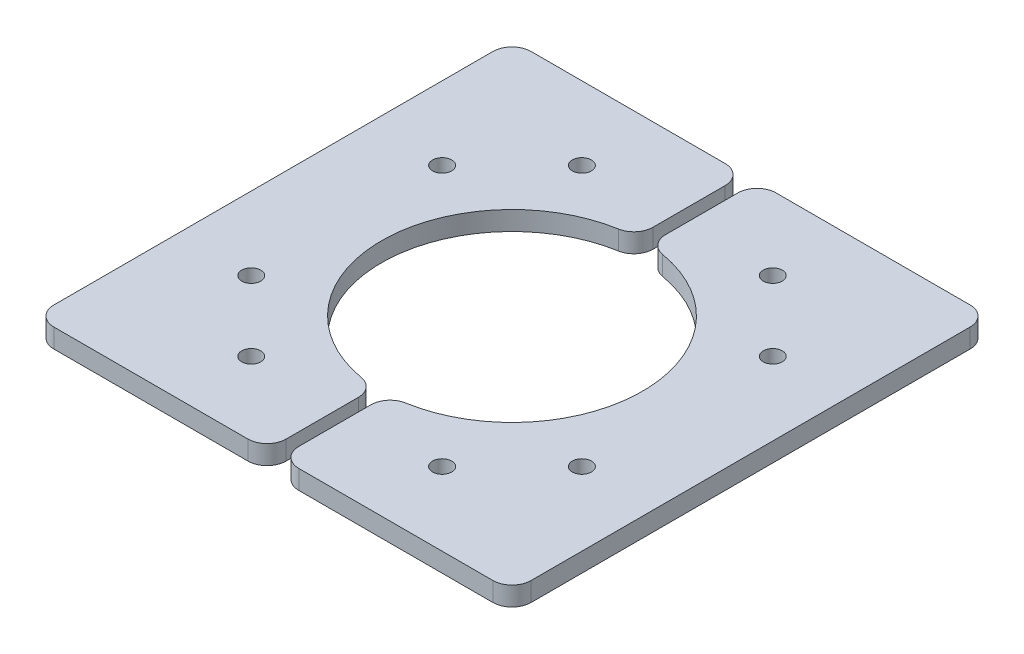
ISO-10303-21;
HEADER;
FILE_DESCRIPTION(('STEP AP214'),'2;1');
FILE_NAME('part.step','',(''),(''),'','','');
FILE_SCHEMA(('AUTOMOTIVE_DESIGN { 1 0 10303 214 1 1 1 1 }'));
ENDSEC;
DATA;
#1=APPLICATION_CONTEXT('core data for automotive mechanical design processes');
#2=APPLICATION_PROTOCOL_DEFINITION('international standard','automotive_design',2000,#1);
#3=PRODUCT_CONTEXT('',#1,'mechanical');
#4=PRODUCT('Part','Part','',(#3));
#5=PRODUCT_RELATED_PRODUCT_CATEGORY('part','',(#4));
#6=PRODUCT_DEFINITION_FORMATION('','',#4);
#7=PRODUCT_DEFINITION_CONTEXT('part definition',#1,'design');
#8=PRODUCT_DEFINITION('design','',#6,#7);
#9=PRODUCT_DEFINITION_SHAPE('','',#8);
#10=(LENGTH_UNIT() NAMED_UNIT(*) SI_UNIT(.MILLI.,.METRE.));
#11=(NAMED_UNIT(*) PLANE_ANGLE_UNIT() SI_UNIT($,.RADIAN.));
#12=(NAMED_UNIT(*) SI_UNIT($,.STERADIAN.) SOLID_ANGLE_UNIT());
#13=UNCERTAINTY_MEASURE_WITH_UNIT(LENGTH_MEASURE(1.E-05),#10,'distance_accuracy_value','');
#14=(GEOMETRIC_REPRESENTATION_CONTEXT(3) GLOBAL_UNCERTAINTY_ASSIGNED_CONTEXT((#13)) GLOBAL_UNIT_ASSIGNED_CONTEXT((#10,
#11,#12)) REPRESENTATION_CONTEXT('',''));
#15=CARTESIAN_POINT('',(0.,0.,0.));
#16=DIRECTION('',(0.,0.,1.));
#17=DIRECTION('',(1.,0.,0.));
#18=AXIS2_PLACEMENT_3D('',#15,#16,#17);
#19=CARTESIAN_POINT('',(0.,3.,-37.5));
#20=DIRECTION('',(0.,0.,-1.));
#21=DIRECTION('',(-1.,0.,0.));
#22=AXIS2_PLACEMENT_3D('',#19,#20,#21);
#23=PLANE('',#22);
#24=DIRECTION('',(1.,0.,0.));
#25=VECTOR('',#24,1.);
#26=CARTESIAN_POINT('',(0.,0.,-37.5));
#27=LINE('',#26,#25);
#28=CARTESIAN_POINT('',(-34.5,0.,-37.5));
#29=VERTEX_POINT('',#28);
#30=CARTESIAN_POINT('',(-4.00000000000001,0.,-37.5));
#31=VERTEX_POINT('',#30);
#32=EDGE_CURVE('E232',#29,#31,#27,.T.);
#33=ORIENTED_EDGE('',*,*,#32,.F.);
#34=DIRECTION('',(0.,-1.,0.));
#35=VECTOR('',#34,1.);
#36=CARTESIAN_POINT('',(-34.5,3.,-37.5));
#37=LINE('',#36,#35);
#38=CARTESIAN_POINT('',(-34.5,3.,-37.5));
#39=VERTEX_POINT('',#38);
#40=EDGE_CURVE('E68',#29,#39,#37,.F.);
#41=ORIENTED_EDGE('',*,*,#40,.T.);
#42=DIRECTION('',(1.,0.,0.));
#43=VECTOR('',#42,1.);
#44=CARTESIAN_POINT('',(0.,3.,-37.5));
#45=LINE('',#44,#43);
#46=CARTESIAN_POINT('',(-4.00000000000001,3.,-37.5));
#47=VERTEX_POINT('',#46);
#48=EDGE_CURVE('E235',#39,#47,#45,.T.);
#49=ORIENTED_EDGE('',*,*,#48,.T.);
#50=DIRECTION('',(0.,-1.,0.));
#51=VECTOR('',#50,1.);
#52=CARTESIAN_POINT('',(-4.00000000000001,3.,-37.5));
#53=LINE('',#52,#51);
#54=EDGE_CURVE('E146',#47,#31,#53,.T.);
#55=ORIENTED_EDGE('',*,*,#54,.T.);
#56=EDGE_LOOP('',(#33,#41,#49,#55));
#57=FACE_BOUND('',#56,.T.);
#58=ADVANCED_FACE('F46',(#57),#23,.T.);
#59=CARTESIAN_POINT('',(0.,3.,0.));
#60=DIRECTION('',(0.,-1.,0.));
#61=DIRECTION('',(0.,0.,-1.));
#62=AXIS2_PLACEMENT_3D('',#59,#60,#61);
#63=CYLINDRICAL_SURFACE('',#62,20.5);
#64=CARTESIAN_POINT('',(0.,0.,0.));
#65=DIRECTION('',(0.,1.,0.));
#66=DIRECTION('',(0.,0.,1.));
#67=AXIS2_PLACEMENT_3D('',#64,#65,#66);
#68=CIRCLE('',#67,20.5);
#69=CARTESIAN_POINT('',(-3.48936170212767,0.,-20.2008503512037));
#70=VERTEX_POINT('',#69);
#71=CARTESIAN_POINT('',(-3.48936170212767,0.,20.2008503512037));
#72=VERTEX_POINT('',#71);
#73=EDGE_CURVE('E229',#70,#72,#68,.T.);
#74=ORIENTED_EDGE('',*,*,#73,.F.);
#75=DIRECTION('',(0.,-1.,0.));
#76=VECTOR('',#75,1.);
#77=CARTESIAN_POINT('',(-3.48936170212767,3.,-20.2008503512037));
#78=LINE('',#77,#76);
#79=CARTESIAN_POINT('',(-3.48936170212767,3.,-20.2008503512037));
#80=VERTEX_POINT('',#79);
#81=EDGE_CURVE('E196',#70,#80,#78,.F.);
#82=ORIENTED_EDGE('',*,*,#81,.T.);
#83=CARTESIAN_POINT('',(0.,3.,0.));
#84=DIRECTION('',(0.,1.,0.));
#85=DIRECTION('',(0.,0.,1.));
#86=AXIS2_PLACEMENT_3D('',#83,#84,#85);
#87=CIRCLE('',#86,20.5);
#88=CARTESIAN_POINT('',(-3.48936170212767,3.,20.2008503512037));
#89=VERTEX_POINT('',#88);
#90=EDGE_CURVE('E237',#80,#89,#87,.T.);
#91=ORIENTED_EDGE('',*,*,#90,.T.);
#92=DIRECTION('',(0.,-1.,0.));
#93=VECTOR('',#92,1.);
#94=CARTESIAN_POINT('',(-3.48936170212767,3.,20.2008503512037));
#95=LINE('',#94,#93);
#96=EDGE_CURVE('E193',#89,#72,#95,.T.);
#97=ORIENTED_EDGE('',*,*,#96,.T.);
#98=EDGE_LOOP('',(#74,#82,#91,#97));
#99=FACE_BOUND('',#98,.T.);
#100=ADVANCED_FACE('F257',(#99),#63,.F.);
#101=CARTESIAN_POINT('',(0.,3.,37.5));
#102=DIRECTION('',(0.,0.,-1.));
#103=DIRECTION('',(-1.,0.,0.));
#104=AXIS2_PLACEMENT_3D('',#101,#102,#103);
#105=PLANE('',#104);
#106=DIRECTION('',(1.,0.,0.));
#107=VECTOR('',#106,1.);
#108=CARTESIAN_POINT('',(0.,3.,37.5));
#109=LINE('',#108,#107);
#110=CARTESIAN_POINT('',(-34.5,3.,37.5));
#111=VERTEX_POINT('',#110);
#112=CARTESIAN_POINT('',(-4.00000000000001,3.,37.5));
#113=VERTEX_POINT('',#112);
#114=EDGE_CURVE('E139',#111,#113,#109,.T.);
#115=ORIENTED_EDGE('',*,*,#114,.F.);
#116=DIRECTION('',(0.,-1.,0.));
#117=VECTOR('',#116,1.);
#118=CARTESIAN_POINT('',(-34.5,3.,37.5));
#119=LINE('',#118,#117);
#120=CARTESIAN_POINT('',(-34.5,0.,37.5));
#121=VERTEX_POINT('',#120);
#122=EDGE_CURVE('E153',#111,#121,#119,.T.);
#123=ORIENTED_EDGE('',*,*,#122,.T.);
#124=DIRECTION('',(1.,0.,0.));
#125=VECTOR('',#124,1.);
#126=CARTESIAN_POINT('',(0.,0.,37.5));
#127=LINE('',#126,#125);
#128=CARTESIAN_POINT('',(-4.00000000000001,0.,37.5));
#129=VERTEX_POINT('',#128);
#130=EDGE_CURVE('E157',#121,#129,#127,.T.);
#131=ORIENTED_EDGE('',*,*,#130,.T.);
#132=DIRECTION('',(0.,-1.,0.));
#133=VECTOR('',#132,1.);
#134=CARTESIAN_POINT('',(-4.00000000000001,3.,37.5));
#135=LINE('',#134,#133);
#136=EDGE_CURVE('E156',#129,#113,#135,.F.);
#137=ORIENTED_EDGE('',*,*,#136,.T.);
#138=EDGE_LOOP('',(#115,#123,#131,#137));
#139=FACE_BOUND('',#138,.T.);
#140=ADVANCED_FACE('F151',(#139),#105,.F.);
#141=CARTESIAN_POINT('',(0.,3.,0.));
#142=DIRECTION('',(0.,1.,0.));
#143=DIRECTION('',(0.,0.,1.));
#144=AXIS2_PLACEMENT_3D('',#141,#142,#143);
#145=PLANE('',#144);
#146=CARTESIAN_POINT('',(-25.9807621135332,3.,14.9999999999999));
#147=DIRECTION('',(0.,-1.,0.));
#148=DIRECTION('',(0.,0.,1.));
#149=AXIS2_PLACEMENT_3D('',#146,#147,#148);
#150=CIRCLE('',#149,1.50000000000001);
#151=CARTESIAN_POINT('',(-25.9807621135332,3.,16.4999999999999));
#152=VERTEX_POINT('',#151);
#153=EDGE_CURVE('E422',#152,#152,#150,.T.);
#154=ORIENTED_EDGE('',*,*,#153,.T.);
#155=EDGE_LOOP('',(#154));
#156=FACE_BOUND('',#155,.T.);
#157=CARTESIAN_POINT('',(-25.9807621135332,3.,-14.9999999999999));
#158=DIRECTION('',(0.,1.,0.));
#159=DIRECTION('',(0.,0.,-1.));
#160=AXIS2_PLACEMENT_3D('',#157,#158,#159);
#161=CIRCLE('',#160,1.50000000000001);
#162=CARTESIAN_POINT('',(-25.9807621135332,3.,-16.4999999999999));
#163=VERTEX_POINT('',#162);
#164=EDGE_CURVE('E426',#163,#163,#161,.T.);
#165=ORIENTED_EDGE('',*,*,#164,.F.);
#166=EDGE_LOOP('',(#165));
#167=FACE_BOUND('',#166,.T.);
#168=CARTESIAN_POINT('',(-15.,3.,-25.9807621135331));
#169=DIRECTION('',(0.,1.,0.));
#170=DIRECTION('',(0.,0.,-1.));
#171=AXIS2_PLACEMENT_3D('',#168,#169,#170);
#172=CIRCLE('',#171,1.49999999999999);
#173=CARTESIAN_POINT('',(-15.,3.,-27.4807621135331));
#174=VERTEX_POINT('',#173);
#175=EDGE_CURVE('E435',#174,#174,#172,.T.);
#176=ORIENTED_EDGE('',*,*,#175,.F.);
#177=EDGE_LOOP('',(#176));
#178=FACE_BOUND('',#177,.T.);
#179=CARTESIAN_POINT('',(-15.,3.,25.9807621135331));
#180=DIRECTION('',(0.,-1.,0.));
#181=DIRECTION('',(0.,0.,1.));
#182=AXIS2_PLACEMENT_3D('',#179,#180,#181);
#183=CIRCLE('',#182,1.5);
#184=CARTESIAN_POINT('',(-15.,3.,27.4807621135331));
#185=VERTEX_POINT('',#184);
#186=EDGE_CURVE('E441',#185,#185,#183,.T.);
#187=ORIENTED_EDGE('',*,*,#186,.T.);
#188=EDGE_LOOP('',(#187));
#189=FACE_BOUND('',#188,.T.);
#190=DIRECTION('',(0.,0.,1.));
#191=VECTOR('',#190,1.);
#192=CARTESIAN_POINT('',(-37.5,3.,0.));
#193=LINE('',#192,#191);
#194=CARTESIAN_POINT('',(-37.5,3.,-34.5));
#195=VERTEX_POINT('',#194);
#196=CARTESIAN_POINT('',(-37.5,3.,34.5));
#197=VERTEX_POINT('',#196);
#198=EDGE_CURVE('E142',#195,#197,#193,.T.);
#199=ORIENTED_EDGE('',*,*,#198,.T.);
#200=CARTESIAN_POINT('',(-34.5,3.,34.5));
#201=DIRECTION('',(0.,1.,0.));
#202=DIRECTION('',(0.,0.,1.));
#203=AXIS2_PLACEMENT_3D('',#200,#201,#202);
#204=CIRCLE('',#203,3.);
#205=EDGE_CURVE('E136',#197,#111,#204,.T.);
#206=ORIENTED_EDGE('',*,*,#205,.T.);
#207=ORIENTED_EDGE('',*,*,#114,.T.);
#208=CARTESIAN_POINT('',(-4.00000000000001,3.,34.5));
#209=DIRECTION('',(0.,1.,0.));
#210=DIRECTION('',(0.,0.,1.));
#211=AXIS2_PLACEMENT_3D('',#208,#209,#210);
#212=CIRCLE('',#211,3.);
#213=CARTESIAN_POINT('',(-1.00000000000001,3.,34.5));
#214=VERTEX_POINT('',#213);
#215=EDGE_CURVE('E183',#113,#214,#212,.T.);
#216=ORIENTED_EDGE('',*,*,#215,.T.);
#217=DIRECTION('',(0.,0.,1.));
#218=VECTOR('',#217,1.);
#219=CARTESIAN_POINT('',(-1.00000000000001,3.,-37.5));
#220=LINE('',#219,#218);
#221=CARTESIAN_POINT('',(-1.00000000000001,3.,23.1570723538188));
#222=VERTEX_POINT('',#221);
#223=EDGE_CURVE('E211',#222,#214,#220,.T.);
#224=ORIENTED_EDGE('',*,*,#223,.F.);
#225=CARTESIAN_POINT('',(-4.00000000000001,3.,23.1570723538188));
#226=DIRECTION('',(0.,1.,0.));
#227=DIRECTION('',(0.,0.,1.));
#228=AXIS2_PLACEMENT_3D('',#225,#226,#227);
#229=CIRCLE('',#228,3.);
#230=EDGE_CURVE('E185',#222,#89,#229,.T.);
#231=ORIENTED_EDGE('',*,*,#230,.T.);
#232=ORIENTED_EDGE('',*,*,#90,.F.);
#233=CARTESIAN_POINT('',(-4.00000000000001,3.,-23.1570723538188));
#234=DIRECTION('',(0.,1.,0.));
#235=DIRECTION('',(0.,0.,1.));
#236=AXIS2_PLACEMENT_3D('',#233,#234,#235);
#237=CIRCLE('',#236,3.);
#238=CARTESIAN_POINT('',(-1.00000000000001,3.,-23.1570723538188));
#239=VERTEX_POINT('',#238);
#240=EDGE_CURVE('E187',#80,#239,#237,.T.);
#241=ORIENTED_EDGE('',*,*,#240,.T.);
#242=CARTESIAN_POINT('',(-1.00000000000001,3.,-34.5));
#243=VERTEX_POINT('',#242);
#244=EDGE_CURVE('E218',#243,#239,#220,.T.);
#245=ORIENTED_EDGE('',*,*,#244,.F.);
#246=CARTESIAN_POINT('',(-4.00000000000001,3.,-34.5));
#247=DIRECTION('',(0.,1.,0.));
#248=DIRECTION('',(0.,0.,1.));
#249=AXIS2_PLACEMENT_3D('',#246,#247,#248);
#250=CIRCLE('',#249,3.);
#251=EDGE_CURVE('E61',#243,#47,#250,.T.);
#252=ORIENTED_EDGE('',*,*,#251,.T.);
#253=ORIENTED_EDGE('',*,*,#48,.F.);
#254=CARTESIAN_POINT('',(-34.5,3.,-34.5));
#255=DIRECTION('',(0.,1.,0.));
#256=DIRECTION('',(0.,0.,1.));
#257=AXIS2_PLACEMENT_3D('',#254,#255,#256);
#258=CIRCLE('',#257,3.);
#259=EDGE_CURVE('E147',#39,#195,#258,.T.);
#260=ORIENTED_EDGE('',*,*,#259,.T.);
#261=EDGE_LOOP('',(#199,#206,#207,#216,#224,#231,#232,#241,#245,#252,#253,#260));
#262=FACE_BOUND('',#261,.T.);
#263=ADVANCED_FACE('F138',(#156,#167,#178,#189,#262),#145,.T.);
#264=CARTESIAN_POINT('',(0.,0.,0.));
#265=DIRECTION('',(0.,1.,0.));
#266=DIRECTION('',(0.,0.,1.));
#267=AXIS2_PLACEMENT_3D('',#264,#265,#266);
#268=PLANE('',#267);
#269=CARTESIAN_POINT('',(-25.9807621135332,0.,14.9999999999999));
#270=DIRECTION('',(0.,-1.,0.));
#271=DIRECTION('',(0.,0.,1.));
#272=AXIS2_PLACEMENT_3D('',#269,#270,#271);
#273=CIRCLE('',#272,1.50000000000001);
#274=CARTESIAN_POINT('',(-25.9807621135332,0.,16.4999999999999));
#275=VERTEX_POINT('',#274);
#276=EDGE_CURVE('E425',#275,#275,#273,.T.);
#277=ORIENTED_EDGE('',*,*,#276,.F.);
#278=EDGE_LOOP('',(#277));
#279=FACE_BOUND('',#278,.T.);
#280=CARTESIAN_POINT('',(-25.9807621135332,0.,-14.9999999999999));
#281=DIRECTION('',(0.,1.,0.));
#282=DIRECTION('',(0.,0.,-1.));
#283=AXIS2_PLACEMENT_3D('',#280,#281,#282);
#284=CIRCLE('',#283,1.50000000000001);
#285=CARTESIAN_POINT('',(-25.9807621135332,0.,-16.4999999999999));
#286=VERTEX_POINT('',#285);
#287=EDGE_CURVE('E429',#286,#286,#284,.T.);
#288=ORIENTED_EDGE('',*,*,#287,.T.);
#289=EDGE_LOOP('',(#288));
#290=FACE_BOUND('',#289,.T.);
#291=CARTESIAN_POINT('',(-15.,0.,-25.9807621135331));
#292=DIRECTION('',(0.,1.,0.));
#293=DIRECTION('',(0.,0.,-1.));
#294=AXIS2_PLACEMENT_3D('',#291,#292,#293);
#295=CIRCLE('',#294,1.49999999999999);
#296=CARTESIAN_POINT('',(-15.,0.,-27.4807621135331));
#297=VERTEX_POINT('',#296);
#298=EDGE_CURVE('E438',#297,#297,#295,.T.);
#299=ORIENTED_EDGE('',*,*,#298,.T.);
#300=EDGE_LOOP('',(#299));
#301=FACE_BOUND('',#300,.T.);
#302=CARTESIAN_POINT('',(-15.,0.,25.9807621135331));
#303=DIRECTION('',(0.,-1.,0.));
#304=DIRECTION('',(0.,0.,1.));
#305=AXIS2_PLACEMENT_3D('',#302,#303,#304);
#306=CIRCLE('',#305,1.5);
#307=CARTESIAN_POINT('',(-15.,0.,27.4807621135331));
#308=VERTEX_POINT('',#307);
#309=EDGE_CURVE('E238',#308,#308,#306,.T.);
#310=ORIENTED_EDGE('',*,*,#309,.F.);
#311=EDGE_LOOP('',(#310));
#312=FACE_BOUND('',#311,.T.);
#313=ORIENTED_EDGE('',*,*,#130,.F.);
#314=CARTESIAN_POINT('',(-34.5,0.,34.5));
#315=DIRECTION('',(0.,1.,0.));
#316=DIRECTION('',(0.,0.,1.));
#317=AXIS2_PLACEMENT_3D('',#314,#315,#316);
#318=CIRCLE('',#317,3.);
#319=CARTESIAN_POINT('',(-37.5,0.,34.5));
#320=VERTEX_POINT('',#319);
#321=EDGE_CURVE('E160',#121,#320,#318,.F.);
#322=ORIENTED_EDGE('',*,*,#321,.T.);
#323=DIRECTION('',(0.,0.,1.));
#324=VECTOR('',#323,1.);
#325=CARTESIAN_POINT('',(-37.5,0.,0.));
#326=LINE('',#325,#324);
#327=CARTESIAN_POINT('',(-37.5,0.,-34.5));
#328=VERTEX_POINT('',#327);
#329=EDGE_CURVE('E223',#328,#320,#326,.T.);
#330=ORIENTED_EDGE('',*,*,#329,.F.);
#331=CARTESIAN_POINT('',(-34.5,0.,-34.5));
#332=DIRECTION('',(0.,1.,0.));
#333=DIRECTION('',(0.,0.,1.));
#334=AXIS2_PLACEMENT_3D('',#331,#332,#333);
#335=CIRCLE('',#334,3.);
#336=EDGE_CURVE('E174',#328,#29,#335,.F.);
#337=ORIENTED_EDGE('',*,*,#336,.T.);
#338=ORIENTED_EDGE('',*,*,#32,.T.);
#339=CARTESIAN_POINT('',(-4.00000000000001,0.,-34.5));
#340=DIRECTION('',(0.,1.,0.));
#341=DIRECTION('',(0.,0.,1.));
#342=AXIS2_PLACEMENT_3D('',#339,#340,#341);
#343=CIRCLE('',#342,3.);
#344=CARTESIAN_POINT('',(-1.00000000000001,0.,-34.5));
#345=VERTEX_POINT('',#344);
#346=EDGE_CURVE('E161',#31,#345,#343,.F.);
#347=ORIENTED_EDGE('',*,*,#346,.T.);
#348=DIRECTION('',(0.,0.,-1.));
#349=VECTOR('',#348,1.);
#350=CARTESIAN_POINT('',(-1.00000000000001,0.,0.));
#351=LINE('',#350,#349);
#352=CARTESIAN_POINT('',(-1.00000000000001,0.,-23.1570723538188));
#353=VERTEX_POINT('',#352);
#354=EDGE_CURVE('E217',#353,#345,#351,.T.);
#355=ORIENTED_EDGE('',*,*,#354,.F.);
#356=CARTESIAN_POINT('',(-4.00000000000001,0.,-23.1570723538188));
#357=DIRECTION('',(0.,1.,0.));
#358=DIRECTION('',(0.,0.,1.));
#359=AXIS2_PLACEMENT_3D('',#356,#357,#358);
#360=CIRCLE('',#359,3.);
#361=EDGE_CURVE('E172',#353,#70,#360,.F.);
#362=ORIENTED_EDGE('',*,*,#361,.T.);
#363=ORIENTED_EDGE('',*,*,#73,.T.);
#364=CARTESIAN_POINT('',(-4.00000000000001,0.,23.1570723538188));
#365=DIRECTION('',(0.,1.,0.));
#366=DIRECTION('',(0.,0.,1.));
#367=AXIS2_PLACEMENT_3D('',#364,#365,#366);
#368=CIRCLE('',#367,3.);
#369=CARTESIAN_POINT('',(-1.00000000000001,0.,23.1570723538188));
#370=VERTEX_POINT('',#369);
#371=EDGE_CURVE('E170',#72,#370,#368,.F.);
#372=ORIENTED_EDGE('',*,*,#371,.T.);
#373=CARTESIAN_POINT('',(-1.00000000000001,0.,34.5));
#374=VERTEX_POINT('',#373);
#375=EDGE_CURVE('E165',#374,#370,#351,.T.);
#376=ORIENTED_EDGE('',*,*,#375,.F.);
#377=CARTESIAN_POINT('',(-4.00000000000001,0.,34.5));
#378=DIRECTION('',(0.,1.,0.));
#379=DIRECTION('',(0.,0.,1.));
#380=AXIS2_PLACEMENT_3D('',#377,#378,#379);
#381=CIRCLE('',#380,3.);
#382=EDGE_CURVE('E163',#374,#129,#381,.F.);
#383=ORIENTED_EDGE('',*,*,#382,.T.);
#384=EDGE_LOOP('',(#313,#322,#330,#337,#338,#347,#355,#362,#363,#372,#376,#383));
#385=FACE_BOUND('',#384,.T.);
#386=ADVANCED_FACE('F214',(#279,#290,#301,#312,#385),#268,.F.);
#387=CARTESIAN_POINT('',(-37.5,3.,0.));
#388=DIRECTION('',(1.,0.,0.));
#389=DIRECTION('',(0.,0.,-1.));
#390=AXIS2_PLACEMENT_3D('',#387,#388,#389);
#391=PLANE('',#390);
#392=ORIENTED_EDGE('',*,*,#329,.T.);
#393=DIRECTION('',(0.,-1.,0.));
#394=VECTOR('',#393,1.);
#395=CARTESIAN_POINT('',(-37.5,3.,34.5));
#396=LINE('',#395,#394);
#397=EDGE_CURVE('E180',#320,#197,#396,.F.);
#398=ORIENTED_EDGE('',*,*,#397,.T.);
#399=ORIENTED_EDGE('',*,*,#198,.F.);
#400=DIRECTION('',(0.,-1.,0.));
#401=VECTOR('',#400,1.);
#402=CARTESIAN_POINT('',(-37.5,0.,-34.5));
#403=LINE('',#402,#401);
#404=EDGE_CURVE('E177',#195,#328,#403,.T.);
#405=ORIENTED_EDGE('',*,*,#404,.T.);
#406=EDGE_LOOP('',(#392,#398,#399,#405));
#407=FACE_BOUND('',#406,.T.);
#408=ADVANCED_FACE('F248',(#407),#391,.F.);
#409=CARTESIAN_POINT('',(-1.00000000000001,3.,-37.5));
#410=DIRECTION('',(1.,0.,0.));
#411=DIRECTION('',(0.,0.,-1.));
#412=AXIS2_PLACEMENT_3D('',#409,#410,#411);
#413=PLANE('',#412);
#414=ORIENTED_EDGE('',*,*,#244,.T.);
#415=DIRECTION('',(0.,-1.,0.));
#416=VECTOR('',#415,1.);
#417=CARTESIAN_POINT('',(-1.00000000000001,3.,-23.1570723538188));
#418=LINE('',#417,#416);
#419=EDGE_CURVE('E201',#239,#353,#418,.T.);
#420=ORIENTED_EDGE('',*,*,#419,.T.);
#421=ORIENTED_EDGE('',*,*,#354,.T.);
#422=DIRECTION('',(0.,-1.,0.));
#423=VECTOR('',#422,1.);
#424=CARTESIAN_POINT('',(-1.00000000000001,3.,-34.5));
#425=LINE('',#424,#423);
#426=EDGE_CURVE('E199',#345,#243,#425,.F.);
#427=ORIENTED_EDGE('',*,*,#426,.T.);
#428=EDGE_LOOP('',(#414,#420,#421,#427));
#429=FACE_BOUND('',#428,.T.);
#430=ADVANCED_FACE('F263',(#429),#413,.T.);
#431=ORIENTED_EDGE('',*,*,#375,.T.);
#432=DIRECTION('',(0.,-1.,0.));
#433=VECTOR('',#432,1.);
#434=CARTESIAN_POINT('',(-1.00000000000001,3.,23.1570723538188));
#435=LINE('',#434,#433);
#436=EDGE_CURVE('E13',#370,#222,#435,.F.);
#437=ORIENTED_EDGE('',*,*,#436,.T.);
#438=ORIENTED_EDGE('',*,*,#223,.T.);
#439=DIRECTION('',(0.,-1.,0.));
#440=VECTOR('',#439,1.);
#441=CARTESIAN_POINT('',(-1.00000000000001,0.,34.5));
#442=LINE('',#441,#440);
#443=EDGE_CURVE('E54',#214,#374,#442,.T.);
#444=ORIENTED_EDGE('',*,*,#443,.T.);
#445=EDGE_LOOP('',(#431,#437,#438,#444));
#446=FACE_BOUND('',#445,.T.);
#447=ADVANCED_FACE('F208',(#446),#413,.T.);
#448=CARTESIAN_POINT('',(-34.5,3.,34.5));
#449=DIRECTION('',(0.,-1.,0.));
#450=DIRECTION('',(0.,0.,-1.));
#451=AXIS2_PLACEMENT_3D('',#448,#449,#450);
#452=CYLINDRICAL_SURFACE('',#451,3.);
#453=ORIENTED_EDGE('',*,*,#205,.F.);
#454=ORIENTED_EDGE('',*,*,#397,.F.);
#455=ORIENTED_EDGE('',*,*,#321,.F.);
#456=ORIENTED_EDGE('',*,*,#122,.F.);
#457=EDGE_LOOP('',(#453,#454,#455,#456));
#458=FACE_BOUND('',#457,.T.);
#459=ADVANCED_FACE('F159',(#458),#452,.T.);
#460=CARTESIAN_POINT('',(-34.5,3.,-34.5));
#461=DIRECTION('',(0.,1.,0.));
#462=DIRECTION('',(0.,0.,1.));
#463=AXIS2_PLACEMENT_3D('',#460,#461,#462);
#464=CYLINDRICAL_SURFACE('',#463,3.);
#465=ORIENTED_EDGE('',*,*,#259,.F.);
#466=ORIENTED_EDGE('',*,*,#40,.F.);
#467=ORIENTED_EDGE('',*,*,#336,.F.);
#468=ORIENTED_EDGE('',*,*,#404,.F.);
#469=EDGE_LOOP('',(#465,#466,#467,#468));
#470=FACE_BOUND('',#469,.T.);
#471=ADVANCED_FACE('F246',(#470),#464,.T.);
#472=CARTESIAN_POINT('',(-4.00000000000001,3.,-23.1570723538188));
#473=DIRECTION('',(0.,-1.,0.));
#474=DIRECTION('',(0.,0.,-1.));
#475=AXIS2_PLACEMENT_3D('',#472,#473,#474);
#476=CYLINDRICAL_SURFACE('',#475,3.);
#477=ORIENTED_EDGE('',*,*,#361,.F.);
#478=ORIENTED_EDGE('',*,*,#419,.F.);
#479=ORIENTED_EDGE('',*,*,#240,.F.);
#480=ORIENTED_EDGE('',*,*,#81,.F.);
#481=EDGE_LOOP('',(#477,#478,#479,#480));
#482=FACE_BOUND('',#481,.T.);
#483=ADVANCED_FACE('F262',(#482),#476,.T.);
#484=CARTESIAN_POINT('',(-4.00000000000001,3.,23.1570723538188));
#485=DIRECTION('',(0.,-1.,0.));
#486=DIRECTION('',(0.,0.,-1.));
#487=AXIS2_PLACEMENT_3D('',#484,#485,#486);
#488=CYLINDRICAL_SURFACE('',#487,3.);
#489=ORIENTED_EDGE('',*,*,#230,.F.);
#490=ORIENTED_EDGE('',*,*,#436,.F.);
#491=ORIENTED_EDGE('',*,*,#371,.F.);
#492=ORIENTED_EDGE('',*,*,#96,.F.);
#493=EDGE_LOOP('',(#489,#490,#491,#492));
#494=FACE_BOUND('',#493,.T.);
#495=ADVANCED_FACE('F254',(#494),#488,.T.);
#496=CARTESIAN_POINT('',(-4.00000000000001,3.,34.5));
#497=DIRECTION('',(0.,1.,0.));
#498=DIRECTION('',(0.,0.,1.));
#499=AXIS2_PLACEMENT_3D('',#496,#497,#498);
#500=CYLINDRICAL_SURFACE('',#499,3.);
#501=ORIENTED_EDGE('',*,*,#215,.F.);
#502=ORIENTED_EDGE('',*,*,#136,.F.);
#503=ORIENTED_EDGE('',*,*,#382,.F.);
#504=ORIENTED_EDGE('',*,*,#443,.F.);
#505=EDGE_LOOP('',(#501,#502,#503,#504));
#506=FACE_BOUND('',#505,.T.);
#507=ADVANCED_FACE('F249',(#506),#500,.T.);
#508=CARTESIAN_POINT('',(-4.00000000000001,3.,-34.5));
#509=DIRECTION('',(0.,-1.,0.));
#510=DIRECTION('',(0.,0.,-1.));
#511=AXIS2_PLACEMENT_3D('',#508,#509,#510);
#512=CYLINDRICAL_SURFACE('',#511,3.);
#513=ORIENTED_EDGE('',*,*,#251,.F.);
#514=ORIENTED_EDGE('',*,*,#426,.F.);
#515=ORIENTED_EDGE('',*,*,#346,.F.);
#516=ORIENTED_EDGE('',*,*,#54,.F.);
#517=EDGE_LOOP('',(#513,#514,#515,#516));
#518=FACE_BOUND('',#517,.T.);
#519=ADVANCED_FACE('F48',(#518),#512,.T.);
#520=CARTESIAN_POINT('',(-15.,3.,25.9807621135331));
#521=DIRECTION('',(0.,-1.,0.));
#522=DIRECTION('',(0.,0.,-1.));
#523=AXIS2_PLACEMENT_3D('',#520,#521,#522);
#524=CYLINDRICAL_SURFACE('',#523,1.5);
#525=ORIENTED_EDGE('',*,*,#186,.F.);
#526=EDGE_LOOP('',(#525));
#527=FACE_BOUND('',#526,.T.);
#528=ORIENTED_EDGE('',*,*,#309,.T.);
#529=EDGE_LOOP('',(#528));
#530=FACE_BOUND('',#529,.T.);
#531=ADVANCED_FACE('F266',(#527,#530),#524,.F.);
#532=CARTESIAN_POINT('',(-15.,3.,-25.9807621135331));
#533=DIRECTION('',(0.,-1.,0.));
#534=DIRECTION('',(0.,0.,-1.));
#535=AXIS2_PLACEMENT_3D('',#532,#533,#534);
#536=CYLINDRICAL_SURFACE('',#535,1.49999999999999);
#537=ORIENTED_EDGE('',*,*,#175,.T.);
#538=EDGE_LOOP('',(#537));
#539=FACE_BOUND('',#538,.T.);
#540=ORIENTED_EDGE('',*,*,#298,.F.);
#541=EDGE_LOOP('',(#540));
#542=FACE_BOUND('',#541,.T.);
#543=ADVANCED_FACE('F271',(#539,#542),#536,.F.);
#544=CARTESIAN_POINT('',(-25.9807621135332,3.,-14.9999999999999));
#545=DIRECTION('',(0.,-1.,0.));
#546=DIRECTION('',(0.,0.,-1.));
#547=AXIS2_PLACEMENT_3D('',#544,#545,#546);
#548=CYLINDRICAL_SURFACE('',#547,1.50000000000001);
#549=ORIENTED_EDGE('',*,*,#164,.T.);
#550=EDGE_LOOP('',(#549));
#551=FACE_BOUND('',#550,.T.);
#552=ORIENTED_EDGE('',*,*,#287,.F.);
#553=EDGE_LOOP('',(#552));
#554=FACE_BOUND('',#553,.T.);
#555=ADVANCED_FACE('F338',(#551,#554),#548,.F.);
#556=CARTESIAN_POINT('',(-25.9807621135332,3.,14.9999999999999));
#557=DIRECTION('',(0.,-1.,0.));
#558=DIRECTION('',(0.,0.,-1.));
#559=AXIS2_PLACEMENT_3D('',#556,#557,#558);
#560=CYLINDRICAL_SURFACE('',#559,1.50000000000001);
#561=ORIENTED_EDGE('',*,*,#153,.F.);
#562=EDGE_LOOP('',(#561));
#563=FACE_BOUND('',#562,.T.);
#564=ORIENTED_EDGE('',*,*,#276,.T.);
#565=EDGE_LOOP('',(#564));
#566=FACE_BOUND('',#565,.T.);
#567=ADVANCED_FACE('F348',(#563,#566),#560,.F.);
#568=CLOSED_SHELL('',(#58,#100,#140,#263,#386,#408,#430,#447,#459,#471,#483,#495,#507,#519,#531,
#543,#555,#567));
#569=MANIFOLD_SOLID_BREP('B2',#568);
#570=CARTESIAN_POINT('',(0.,3.,0.));
#571=DIRECTION('',(0.,1.,0.));
#572=DIRECTION('',(0.,0.,1.));
#573=AXIS2_PLACEMENT_3D('',#570,#571,#572);
#574=PLANE('',#573);
#575=CARTESIAN_POINT('',(25.9807621135332,3.,14.9999999999999));
#576=DIRECTION('',(0.,1.,0.));
#577=DIRECTION('',(0.,0.,1.));
#578=AXIS2_PLACEMENT_3D('',#575,#576,#577);
#579=CIRCLE('',#578,1.50000000000001);
#580=CARTESIAN_POINT('',(25.9807621135332,3.,16.4999999999999));
#581=VERTEX_POINT('',#580);
#582=EDGE_CURVE('E663',#581,#581,#579,.T.);
#583=ORIENTED_EDGE('',*,*,#582,.F.);
#584=EDGE_LOOP('',(#583));
#585=FACE_BOUND('',#584,.T.);
#586=CARTESIAN_POINT('',(25.9807621135332,3.,-14.9999999999999));
#587=DIRECTION('',(0.,-1.,0.));
#588=DIRECTION('',(0.,0.,-1.));
#589=AXIS2_PLACEMENT_3D('',#586,#587,#588);
#590=CIRCLE('',#589,1.50000000000001);
#591=CARTESIAN_POINT('',(25.9807621135332,3.,-16.4999999999999));
#592=VERTEX_POINT('',#591);
#593=EDGE_CURVE('E657',#592,#592,#590,.T.);
#594=ORIENTED_EDGE('',*,*,#593,.T.);
#595=EDGE_LOOP('',(#594));
#596=FACE_BOUND('',#595,.T.);
#597=CARTESIAN_POINT('',(15.,3.,-25.9807621135331));
#598=DIRECTION('',(0.,-1.,0.));
#599=DIRECTION('',(0.,0.,-1.));
#600=AXIS2_PLACEMENT_3D('',#597,#598,#599);
#601=CIRCLE('',#600,1.49999999999999);
#602=CARTESIAN_POINT('',(15.,3.,-27.4807621135331));
#603=VERTEX_POINT('',#602);
#604=EDGE_CURVE('E651',#603,#603,#601,.T.);
#605=ORIENTED_EDGE('',*,*,#604,.T.);
#606=EDGE_LOOP('',(#605));
#607=FACE_BOUND('',#606,.T.);
#608=DIRECTION('',(1.,0.,0.));
#609=VECTOR('',#608,1.);
#610=CARTESIAN_POINT('',(0.,3.,37.5));
#611=LINE('',#610,#609);
#612=CARTESIAN_POINT('',(3.99999999999999,3.,37.5));
#613=VERTEX_POINT('',#612);
#614=CARTESIAN_POINT('',(34.5,3.,37.5));
#615=VERTEX_POINT('',#614);
#616=EDGE_CURVE('E628',#613,#615,#611,.T.);
#617=ORIENTED_EDGE('',*,*,#616,.T.);
#618=CARTESIAN_POINT('',(34.5,3.,34.5));
#619=DIRECTION('',(0.,1.,0.));
#620=DIRECTION('',(0.,0.,1.));
#621=AXIS2_PLACEMENT_3D('',#618,#619,#620);
#622=CIRCLE('',#621,3.);
#623=CARTESIAN_POINT('',(37.5,3.,34.5));
#624=VERTEX_POINT('',#623);
#625=EDGE_CURVE('E606',#615,#624,#622,.T.);
#626=ORIENTED_EDGE('',*,*,#625,.T.);
#627=DIRECTION('',(0.,0.,1.));
#628=VECTOR('',#627,1.);
#629=CARTESIAN_POINT('',(37.5,3.,0.));
#630=LINE('',#629,#628);
#631=CARTESIAN_POINT('',(37.5,3.,-34.5));
#632=VERTEX_POINT('',#631);
#633=EDGE_CURVE('E629',#632,#624,#630,.T.);
#634=ORIENTED_EDGE('',*,*,#633,.F.);
#635=CARTESIAN_POINT('',(34.5,3.,-34.5));
#636=DIRECTION('',(0.,1.,0.));
#637=DIRECTION('',(0.,0.,1.));
#638=AXIS2_PLACEMENT_3D('',#635,#636,#637);
#639=CIRCLE('',#638,3.);
#640=CARTESIAN_POINT('',(34.5,3.,-37.5));
#641=VERTEX_POINT('',#640);
#642=EDGE_CURVE('E575',#632,#641,#639,.T.);
#643=ORIENTED_EDGE('',*,*,#642,.T.);
#644=DIRECTION('',(1.,0.,0.));
#645=VECTOR('',#644,1.);
#646=CARTESIAN_POINT('',(0.,3.,-37.5));
#647=LINE('',#646,#645);
#648=CARTESIAN_POINT('',(3.99999999999999,3.,-37.5));
#649=VERTEX_POINT('',#648);
#650=EDGE_CURVE('E626',#649,#641,#647,.T.);
#651=ORIENTED_EDGE('',*,*,#650,.F.);
#652=CARTESIAN_POINT('',(3.99999999999999,3.,-34.5));
#653=DIRECTION('',(0.,1.,0.));
#654=DIRECTION('',(0.,0.,1.));
#655=AXIS2_PLACEMENT_3D('',#652,#653,#654);
#656=CIRCLE('',#655,3.);
#657=CARTESIAN_POINT('',(0.999999999999993,3.,-34.5));
#658=VERTEX_POINT('',#657);
#659=EDGE_CURVE('E599',#649,#658,#656,.T.);
#660=ORIENTED_EDGE('',*,*,#659,.T.);
#661=DIRECTION('',(0.,0.,-1.));
#662=VECTOR('',#661,1.);
#663=CARTESIAN_POINT('',(0.999999999999993,3.,-37.5));
#664=LINE('',#663,#662);
#665=CARTESIAN_POINT('',(0.999999999999993,3.,-23.1570723538188));
#666=VERTEX_POINT('',#665);
#667=EDGE_CURVE('E650',#666,#658,#664,.T.);
#668=ORIENTED_EDGE('',*,*,#667,.F.);
#669=CARTESIAN_POINT('',(3.99999999999999,3.,-23.1570723538188));
#670=DIRECTION('',(0.,1.,0.));
#671=DIRECTION('',(0.,0.,1.));
#672=AXIS2_PLACEMENT_3D('',#669,#670,#671);
#673=CIRCLE('',#672,3.);
#674=CARTESIAN_POINT('',(3.48936170212765,3.,-20.2008503512037));
#675=VERTEX_POINT('',#674);
#676=EDGE_CURVE('E601',#666,#675,#673,.T.);
#677=ORIENTED_EDGE('',*,*,#676,.T.);
#678=CARTESIAN_POINT('',(0.,3.,0.));
#679=DIRECTION('',(0.,1.,0.));
#680=DIRECTION('',(0.,0.,1.));
#681=AXIS2_PLACEMENT_3D('',#678,#679,#680);
#682=CIRCLE('',#681,20.5);
#683=CARTESIAN_POINT('',(3.48936170212765,3.,20.2008503512037));
#684=VERTEX_POINT('',#683);
#685=EDGE_CURVE('E633',#684,#675,#682,.T.);
#686=ORIENTED_EDGE('',*,*,#685,.F.);
#687=CARTESIAN_POINT('',(3.99999999999999,3.,23.1570723538188));
#688=DIRECTION('',(0.,1.,0.));
#689=DIRECTION('',(0.,0.,1.));
#690=AXIS2_PLACEMENT_3D('',#687,#688,#689);
#691=CIRCLE('',#690,3.);
#692=CARTESIAN_POINT('',(0.999999999999993,3.,23.1570723538188));
#693=VERTEX_POINT('',#692);
#694=EDGE_CURVE('E477',#684,#693,#691,.T.);
#695=ORIENTED_EDGE('',*,*,#694,.T.);
#696=CARTESIAN_POINT('',(0.999999999999993,3.,34.5));
#697=VERTEX_POINT('',#696);
#698=EDGE_CURVE('E638',#697,#693,#664,.T.);
#699=ORIENTED_EDGE('',*,*,#698,.F.);
#700=CARTESIAN_POINT('',(3.99999999999999,3.,34.5));
#701=DIRECTION('',(0.,1.,0.));
#702=DIRECTION('',(0.,0.,1.));
#703=AXIS2_PLACEMENT_3D('',#700,#701,#702);
#704=CIRCLE('',#703,3.);
#705=EDGE_CURVE('E604',#697,#613,#704,.T.);
#706=ORIENTED_EDGE('',*,*,#705,.T.);
#707=EDGE_LOOP('',(#617,#626,#634,#643,#651,#660,#668,#677,#686,#695,#699,#706));
#708=FACE_BOUND('',#707,.T.);
#709=CARTESIAN_POINT('',(15.,3.,25.9807621135331));
#710=DIRECTION('',(0.,1.,0.));
#711=DIRECTION('',(0.,0.,1.));
#712=AXIS2_PLACEMENT_3D('',#709,#710,#711);
#713=CIRCLE('',#712,1.5);
#714=CARTESIAN_POINT('',(15.,3.,27.4807621135331));
#715=VERTEX_POINT('',#714);
#716=EDGE_CURVE('E672',#715,#715,#713,.T.);
#717=ORIENTED_EDGE('',*,*,#716,.F.);
#718=EDGE_LOOP('',(#717));
#719=FACE_BOUND('',#718,.T.);
#720=ADVANCED_FACE('F462',(#585,#596,#607,#708,#719),#574,.T.);
#721=CARTESIAN_POINT('',(0.,0.,0.));
#722=DIRECTION('',(0.,1.,0.));
#723=DIRECTION('',(0.,0.,1.));
#724=AXIS2_PLACEMENT_3D('',#721,#722,#723);
#725=PLANE('',#724);
#726=CARTESIAN_POINT('',(25.9807621135332,0.,-14.9999999999999));
#727=DIRECTION('',(0.,-1.,0.));
#728=DIRECTION('',(0.,0.,-1.));
#729=AXIS2_PLACEMENT_3D('',#726,#727,#728);
#730=CIRCLE('',#729,1.50000000000001);
#731=CARTESIAN_POINT('',(25.9807621135332,0.,-16.4999999999999));
#732=VERTEX_POINT('',#731);
#733=EDGE_CURVE('E660',#732,#732,#730,.T.);
#734=ORIENTED_EDGE('',*,*,#733,.F.);
#735=EDGE_LOOP('',(#734));
#736=FACE_BOUND('',#735,.T.);
#737=CARTESIAN_POINT('',(15.,0.,-25.9807621135331));
#738=DIRECTION('',(0.,-1.,0.));
#739=DIRECTION('',(0.,0.,-1.));
#740=AXIS2_PLACEMENT_3D('',#737,#738,#739);
#741=CIRCLE('',#740,1.49999999999999);
#742=CARTESIAN_POINT('',(15.,0.,-27.4807621135331));
#743=VERTEX_POINT('',#742);
#744=EDGE_CURVE('E654',#743,#743,#741,.T.);
#745=ORIENTED_EDGE('',*,*,#744,.F.);
#746=EDGE_LOOP('',(#745));
#747=FACE_BOUND('',#746,.T.);
#748=DIRECTION('',(0.,0.,1.));
#749=VECTOR('',#748,1.);
#750=CARTESIAN_POINT('',(37.5,0.,0.));
#751=LINE('',#750,#749);
#752=CARTESIAN_POINT('',(37.5,0.,-34.5));
#753=VERTEX_POINT('',#752);
#754=CARTESIAN_POINT('',(37.5,0.,34.5));
#755=VERTEX_POINT('',#754);
#756=EDGE_CURVE('E555',#753,#755,#751,.T.);
#757=ORIENTED_EDGE('',*,*,#756,.T.);
#758=CARTESIAN_POINT('',(34.5,0.,34.5));
#759=DIRECTION('',(0.,1.,0.));
#760=DIRECTION('',(0.,0.,1.));
#761=AXIS2_PLACEMENT_3D('',#758,#759,#760);
#762=CIRCLE('',#761,3.);
#763=CARTESIAN_POINT('',(34.5,0.,37.5));
#764=VERTEX_POINT('',#763);
#765=EDGE_CURVE('E591',#755,#764,#762,.F.);
#766=ORIENTED_EDGE('',*,*,#765,.T.);
#767=DIRECTION('',(1.,0.,0.));
#768=VECTOR('',#767,1.);
#769=CARTESIAN_POINT('',(0.,0.,37.5));
#770=LINE('',#769,#768);
#771=CARTESIAN_POINT('',(3.99999999999999,0.,37.5));
#772=VERTEX_POINT('',#771);
#773=EDGE_CURVE('E640',#772,#764,#770,.T.);
#774=ORIENTED_EDGE('',*,*,#773,.F.);
#775=CARTESIAN_POINT('',(3.99999999999999,0.,34.5));
#776=DIRECTION('',(0.,1.,0.));
#777=DIRECTION('',(0.,0.,1.));
#778=AXIS2_PLACEMENT_3D('',#775,#776,#777);
#779=CIRCLE('',#778,3.);
#780=CARTESIAN_POINT('',(0.999999999999993,0.,34.5));
#781=VERTEX_POINT('',#780);
#782=EDGE_CURVE('E589',#772,#781,#779,.F.);
#783=ORIENTED_EDGE('',*,*,#782,.T.);
#784=DIRECTION('',(0.,0.,1.));
#785=VECTOR('',#784,1.);
#786=CARTESIAN_POINT('',(0.999999999999993,0.,0.));
#787=LINE('',#786,#785);
#788=CARTESIAN_POINT('',(0.999999999999993,0.,23.1570723538188));
#789=VERTEX_POINT('',#788);
#790=EDGE_CURVE('E580',#789,#781,#787,.T.);
#791=ORIENTED_EDGE('',*,*,#790,.F.);
#792=CARTESIAN_POINT('',(3.99999999999999,0.,23.1570723538188));
#793=DIRECTION('',(0.,1.,0.));
#794=DIRECTION('',(0.,0.,1.));
#795=AXIS2_PLACEMENT_3D('',#792,#793,#794);
#796=CIRCLE('',#795,3.);
#797=CARTESIAN_POINT('',(3.48936170212765,0.,20.2008503512037));
#798=VERTEX_POINT('',#797);
#799=EDGE_CURVE('E587',#789,#798,#796,.F.);
#800=ORIENTED_EDGE('',*,*,#799,.T.);
#801=CARTESIAN_POINT('',(0.,0.,0.));
#802=DIRECTION('',(0.,1.,0.));
#803=DIRECTION('',(0.,0.,1.));
#804=AXIS2_PLACEMENT_3D('',#801,#802,#803);
#805=CIRCLE('',#804,20.5);
#806=CARTESIAN_POINT('',(3.48936170212765,0.,-20.2008503512037));
#807=VERTEX_POINT('',#806);
#808=EDGE_CURVE('E572',#798,#807,#805,.T.);
#809=ORIENTED_EDGE('',*,*,#808,.T.);
#810=CARTESIAN_POINT('',(3.99999999999999,0.,-23.1570723538188));
#811=DIRECTION('',(0.,1.,0.));
#812=DIRECTION('',(0.,0.,1.));
#813=AXIS2_PLACEMENT_3D('',#810,#811,#812);
#814=CIRCLE('',#813,3.);
#815=CARTESIAN_POINT('',(0.999999999999993,0.,-23.1570723538188));
#816=VERTEX_POINT('',#815);
#817=EDGE_CURVE('E585',#807,#816,#814,.F.);
#818=ORIENTED_EDGE('',*,*,#817,.T.);
#819=CARTESIAN_POINT('',(0.999999999999993,0.,-34.5));
#820=VERTEX_POINT('',#819);
#821=EDGE_CURVE('E576',#820,#816,#787,.T.);
#822=ORIENTED_EDGE('',*,*,#821,.F.);
#823=CARTESIAN_POINT('',(3.99999999999999,0.,-34.5));
#824=DIRECTION('',(0.,1.,0.));
#825=DIRECTION('',(0.,0.,1.));
#826=AXIS2_PLACEMENT_3D('',#823,#824,#825);
#827=CIRCLE('',#826,3.);
#828=CARTESIAN_POINT('',(3.99999999999999,0.,-37.5));
#829=VERTEX_POINT('',#828);
#830=EDGE_CURVE('E562',#820,#829,#827,.F.);
#831=ORIENTED_EDGE('',*,*,#830,.T.);
#832=DIRECTION('',(1.,0.,0.));
#833=VECTOR('',#832,1.);
#834=CARTESIAN_POINT('',(0.,0.,-37.5));
#835=LINE('',#834,#833);
#836=CARTESIAN_POINT('',(34.5,0.,-37.5));
#837=VERTEX_POINT('',#836);
#838=EDGE_CURVE('E557',#829,#837,#835,.T.);
#839=ORIENTED_EDGE('',*,*,#838,.T.);
#840=CARTESIAN_POINT('',(34.5,0.,-34.5));
#841=DIRECTION('',(0.,1.,0.));
#842=DIRECTION('',(0.,0.,1.));
#843=AXIS2_PLACEMENT_3D('',#840,#841,#842);
#844=CIRCLE('',#843,3.);
#845=EDGE_CURVE('E551',#837,#753,#844,.F.);
#846=ORIENTED_EDGE('',*,*,#845,.T.);
#847=EDGE_LOOP('',(#757,#766,#774,#783,#791,#800,#809,#818,#822,#831,#839,#846));
#848=FACE_BOUND('',#847,.T.);
#849=CARTESIAN_POINT('',(25.9807621135332,0.,14.9999999999999));
#850=DIRECTION('',(0.,1.,0.));
#851=DIRECTION('',(0.,0.,1.));
#852=AXIS2_PLACEMENT_3D('',#849,#850,#851);
#853=CIRCLE('',#852,1.50000000000001);
#854=CARTESIAN_POINT('',(25.9807621135332,0.,16.4999999999999));
#855=VERTEX_POINT('',#854);
#856=EDGE_CURVE('E666',#855,#855,#853,.T.);
#857=ORIENTED_EDGE('',*,*,#856,.T.);
#858=EDGE_LOOP('',(#857));
#859=FACE_BOUND('',#858,.T.);
#860=CARTESIAN_POINT('',(15.,0.,25.9807621135331));
#861=DIRECTION('',(0.,1.,0.));
#862=DIRECTION('',(0.,0.,1.));
#863=AXIS2_PLACEMENT_3D('',#860,#861,#862);
#864=CIRCLE('',#863,1.5);
#865=CARTESIAN_POINT('',(15.,0.,27.4807621135331));
#866=VERTEX_POINT('',#865);
#867=EDGE_CURVE('E669',#866,#866,#864,.T.);
#868=ORIENTED_EDGE('',*,*,#867,.T.);
#869=EDGE_LOOP('',(#868));
#870=FACE_BOUND('',#869,.T.);
#871=ADVANCED_FACE('F553',(#736,#747,#848,#859,#870),#725,.F.);
#872=CARTESIAN_POINT('',(37.5,3.,0.));
#873=DIRECTION('',(1.,0.,0.));
#874=DIRECTION('',(0.,0.,-1.));
#875=AXIS2_PLACEMENT_3D('',#872,#873,#874);
#876=PLANE('',#875);
#877=ORIENTED_EDGE('',*,*,#633,.T.);
#878=DIRECTION('',(0.,-1.,0.));
#879=VECTOR('',#878,1.);
#880=CARTESIAN_POINT('',(37.5,0.,34.5));
#881=LINE('',#880,#879);
#882=EDGE_CURVE('E563',#624,#755,#881,.T.);
#883=ORIENTED_EDGE('',*,*,#882,.T.);
#884=ORIENTED_EDGE('',*,*,#756,.F.);
#885=DIRECTION('',(0.,-1.,0.));
#886=VECTOR('',#885,1.);
#887=CARTESIAN_POINT('',(37.5,3.,-34.5));
#888=LINE('',#887,#886);
#889=EDGE_CURVE('E569',#753,#632,#888,.F.);
#890=ORIENTED_EDGE('',*,*,#889,.T.);
#891=EDGE_LOOP('',(#877,#883,#884,#890));
#892=FACE_BOUND('',#891,.T.);
#893=ADVANCED_FACE('F568',(#892),#876,.T.);
#894=CARTESIAN_POINT('',(0.,3.,37.5));
#895=DIRECTION('',(0.,0.,-1.));
#896=DIRECTION('',(-1.,0.,0.));
#897=AXIS2_PLACEMENT_3D('',#894,#895,#896);
#898=PLANE('',#897);
#899=ORIENTED_EDGE('',*,*,#773,.T.);
#900=DIRECTION('',(0.,-1.,0.));
#901=VECTOR('',#900,1.);
#902=CARTESIAN_POINT('',(34.5,3.,37.5));
#903=LINE('',#902,#901);
#904=EDGE_CURVE('E596',#764,#615,#903,.F.);
#905=ORIENTED_EDGE('',*,*,#904,.T.);
#906=ORIENTED_EDGE('',*,*,#616,.F.);
#907=DIRECTION('',(0.,-1.,0.));
#908=VECTOR('',#907,1.);
#909=CARTESIAN_POINT('',(3.99999999999999,0.,37.5));
#910=LINE('',#909,#908);
#911=EDGE_CURVE('E593',#613,#772,#910,.T.);
#912=ORIENTED_EDGE('',*,*,#911,.T.);
#913=EDGE_LOOP('',(#899,#905,#906,#912));
#914=FACE_BOUND('',#913,.T.);
#915=ADVANCED_FACE('F705',(#914),#898,.F.);
#916=CARTESIAN_POINT('',(0.,3.,0.));
#917=DIRECTION('',(0.,-1.,0.));
#918=DIRECTION('',(0.,0.,-1.));
#919=AXIS2_PLACEMENT_3D('',#916,#917,#918);
#920=CYLINDRICAL_SURFACE('',#919,20.5);
#921=ORIENTED_EDGE('',*,*,#808,.F.);
#922=DIRECTION('',(0.,-1.,0.));
#923=VECTOR('',#922,1.);
#924=CARTESIAN_POINT('',(3.48936170212765,3.,20.2008503512037));
#925=LINE('',#924,#923);
#926=EDGE_CURVE('E614',#798,#684,#925,.F.);
#927=ORIENTED_EDGE('',*,*,#926,.T.);
#928=ORIENTED_EDGE('',*,*,#685,.T.);
#929=DIRECTION('',(0.,-1.,0.));
#930=VECTOR('',#929,1.);
#931=CARTESIAN_POINT('',(3.48936170212765,3.,-20.2008503512037));
#932=LINE('',#931,#930);
#933=EDGE_CURVE('E611',#675,#807,#932,.T.);
#934=ORIENTED_EDGE('',*,*,#933,.T.);
#935=EDGE_LOOP('',(#921,#927,#928,#934));
#936=FACE_BOUND('',#935,.T.);
#937=ADVANCED_FACE('F708',(#936),#920,.F.);
#938=CARTESIAN_POINT('',(0.,3.,-37.5));
#939=DIRECTION('',(0.,0.,-1.));
#940=DIRECTION('',(-1.,0.,0.));
#941=AXIS2_PLACEMENT_3D('',#938,#939,#940);
#942=PLANE('',#941);
#943=ORIENTED_EDGE('',*,*,#838,.F.);
#944=DIRECTION('',(0.,-1.,0.));
#945=VECTOR('',#944,1.);
#946=CARTESIAN_POINT('',(3.99999999999999,3.,-37.5));
#947=LINE('',#946,#945);
#948=EDGE_CURVE('E44',#829,#649,#947,.F.);
#949=ORIENTED_EDGE('',*,*,#948,.T.);
#950=ORIENTED_EDGE('',*,*,#650,.T.);
#951=DIRECTION('',(0.,-1.,0.));
#952=VECTOR('',#951,1.);
#953=CARTESIAN_POINT('',(34.5,3.,-37.5));
#954=LINE('',#953,#952);
#955=EDGE_CURVE('E470',#641,#837,#954,.T.);
#956=ORIENTED_EDGE('',*,*,#955,.T.);
#957=EDGE_LOOP('',(#943,#949,#950,#956));
#958=FACE_BOUND('',#957,.T.);
#959=ADVANCED_FACE('F623',(#958),#942,.T.);
#960=CARTESIAN_POINT('',(0.999999999999993,3.,-37.5));
#961=DIRECTION('',(-1.,0.,0.));
#962=DIRECTION('',(0.,0.,1.));
#963=AXIS2_PLACEMENT_3D('',#960,#961,#962);
#964=PLANE('',#963);
#965=ORIENTED_EDGE('',*,*,#790,.T.);
#966=DIRECTION('',(0.,-1.,0.));
#967=VECTOR('',#966,1.);
#968=CARTESIAN_POINT('',(0.999999999999993,3.,34.5));
#969=LINE('',#968,#967);
#970=EDGE_CURVE('E484',#781,#697,#969,.F.);
#971=ORIENTED_EDGE('',*,*,#970,.T.);
#972=ORIENTED_EDGE('',*,*,#698,.T.);
#973=DIRECTION('',(0.,-1.,0.));
#974=VECTOR('',#973,1.);
#975=CARTESIAN_POINT('',(0.999999999999993,3.,23.1570723538188));
#976=LINE('',#975,#974);
#977=EDGE_CURVE('E608',#693,#789,#976,.T.);
#978=ORIENTED_EDGE('',*,*,#977,.T.);
#979=EDGE_LOOP('',(#965,#971,#972,#978));
#980=FACE_BOUND('',#979,.T.);
#981=ADVANCED_FACE('F702',(#980),#964,.T.);
#982=ORIENTED_EDGE('',*,*,#821,.T.);
#983=DIRECTION('',(0.,-1.,0.));
#984=VECTOR('',#983,1.);
#985=CARTESIAN_POINT('',(0.999999999999993,3.,-23.1570723538188));
#986=LINE('',#985,#984);
#987=EDGE_CURVE('E620',#816,#666,#986,.F.);
#988=ORIENTED_EDGE('',*,*,#987,.T.);
#989=ORIENTED_EDGE('',*,*,#667,.T.);
#990=DIRECTION('',(0.,-1.,0.));
#991=VECTOR('',#990,1.);
#992=CARTESIAN_POINT('',(0.999999999999993,3.,-34.5));
#993=LINE('',#992,#991);
#994=EDGE_CURVE('E617',#658,#820,#993,.T.);
#995=ORIENTED_EDGE('',*,*,#994,.T.);
#996=EDGE_LOOP('',(#982,#988,#989,#995));
#997=FACE_BOUND('',#996,.T.);
#998=ADVANCED_FACE('F680',(#997),#964,.T.);
#999=CARTESIAN_POINT('',(15.,3.,-25.9807621135331));
#1000=DIRECTION('',(0.,-1.,0.));
#1001=DIRECTION('',(0.,0.,-1.));
#1002=AXIS2_PLACEMENT_3D('',#999,#1000,#1001);
#1003=CYLINDRICAL_SURFACE('',#1002,1.49999999999999);
#1004=ORIENTED_EDGE('',*,*,#604,.F.);
#1005=EDGE_LOOP('',(#1004));
#1006=FACE_BOUND('',#1005,.T.);
#1007=ORIENTED_EDGE('',*,*,#744,.T.);
#1008=EDGE_LOOP('',(#1007));
#1009=FACE_BOUND('',#1008,.T.);
#1010=ADVANCED_FACE('F774',(#1006,#1009),#1003,.F.);
#1011=CARTESIAN_POINT('',(25.9807621135332,3.,-14.9999999999999));
#1012=DIRECTION('',(0.,-1.,0.));
#1013=DIRECTION('',(0.,0.,-1.));
#1014=AXIS2_PLACEMENT_3D('',#1011,#1012,#1013);
#1015=CYLINDRICAL_SURFACE('',#1014,1.50000000000001);
#1016=ORIENTED_EDGE('',*,*,#593,.F.);
#1017=EDGE_LOOP('',(#1016));
#1018=FACE_BOUND('',#1017,.T.);
#1019=ORIENTED_EDGE('',*,*,#733,.T.);
#1020=EDGE_LOOP('',(#1019));
#1021=FACE_BOUND('',#1020,.T.);
#1022=ADVANCED_FACE('F833',(#1018,#1021),#1015,.F.);
#1023=CARTESIAN_POINT('',(25.9807621135332,3.,14.9999999999999));
#1024=DIRECTION('',(0.,-1.,0.));
#1025=DIRECTION('',(0.,0.,-1.));
#1026=AXIS2_PLACEMENT_3D('',#1023,#1024,#1025);
#1027=CYLINDRICAL_SURFACE('',#1026,1.50000000000001);
#1028=ORIENTED_EDGE('',*,*,#582,.T.);
#1029=EDGE_LOOP('',(#1028));
#1030=FACE_BOUND('',#1029,.T.);
#1031=ORIENTED_EDGE('',*,*,#856,.F.);
#1032=EDGE_LOOP('',(#1031));
#1033=FACE_BOUND('',#1032,.T.);
#1034=ADVANCED_FACE('F824',(#1030,#1033),#1027,.F.);
#1035=CARTESIAN_POINT('',(15.,3.,25.9807621135331));
#1036=DIRECTION('',(0.,-1.,0.));
#1037=DIRECTION('',(0.,0.,-1.));
#1038=AXIS2_PLACEMENT_3D('',#1035,#1036,#1037);
#1039=CYLINDRICAL_SURFACE('',#1038,1.5);
#1040=ORIENTED_EDGE('',*,*,#716,.T.);
#1041=EDGE_LOOP('',(#1040));
#1042=FACE_BOUND('',#1041,.T.);
#1043=ORIENTED_EDGE('',*,*,#867,.F.);
#1044=EDGE_LOOP('',(#1043));
#1045=FACE_BOUND('',#1044,.T.);
#1046=ADVANCED_FACE('F719',(#1042,#1045),#1039,.F.);
#1047=CARTESIAN_POINT('',(34.5,3.,34.5));
#1048=DIRECTION('',(0.,1.,0.));
#1049=DIRECTION('',(0.,0.,1.));
#1050=AXIS2_PLACEMENT_3D('',#1047,#1048,#1049);
#1051=CYLINDRICAL_SURFACE('',#1050,3.);
#1052=ORIENTED_EDGE('',*,*,#625,.F.);
#1053=ORIENTED_EDGE('',*,*,#904,.F.);
#1054=ORIENTED_EDGE('',*,*,#765,.F.);
#1055=ORIENTED_EDGE('',*,*,#882,.F.);
#1056=EDGE_LOOP('',(#1052,#1053,#1054,#1055));
#1057=FACE_BOUND('',#1056,.T.);
#1058=ADVANCED_FACE('F715',(#1057),#1051,.T.);
#1059=CARTESIAN_POINT('',(3.99999999999999,3.,34.5));
#1060=DIRECTION('',(0.,1.,0.));
#1061=DIRECTION('',(0.,0.,1.));
#1062=AXIS2_PLACEMENT_3D('',#1059,#1060,#1061);
#1063=CYLINDRICAL_SURFACE('',#1062,3.);
#1064=ORIENTED_EDGE('',*,*,#705,.F.);
#1065=ORIENTED_EDGE('',*,*,#970,.F.);
#1066=ORIENTED_EDGE('',*,*,#782,.F.);
#1067=ORIENTED_EDGE('',*,*,#911,.F.);
#1068=EDGE_LOOP('',(#1064,#1065,#1066,#1067));
#1069=FACE_BOUND('',#1068,.T.);
#1070=ADVANCED_FACE('F718',(#1069),#1063,.T.);
#1071=CARTESIAN_POINT('',(3.99999999999999,3.,23.1570723538188));
#1072=DIRECTION('',(0.,-1.,0.));
#1073=DIRECTION('',(0.,0.,-1.));
#1074=AXIS2_PLACEMENT_3D('',#1071,#1072,#1073);
#1075=CYLINDRICAL_SURFACE('',#1074,3.);
#1076=ORIENTED_EDGE('',*,*,#799,.F.);
#1077=ORIENTED_EDGE('',*,*,#977,.F.);
#1078=ORIENTED_EDGE('',*,*,#694,.F.);
#1079=ORIENTED_EDGE('',*,*,#926,.F.);
#1080=EDGE_LOOP('',(#1076,#1077,#1078,#1079));
#1081=FACE_BOUND('',#1080,.T.);
#1082=ADVANCED_FACE('F723',(#1081),#1075,.T.);
#1083=CARTESIAN_POINT('',(3.99999999999999,3.,-23.1570723538188));
#1084=DIRECTION('',(0.,-1.,0.));
#1085=DIRECTION('',(0.,0.,-1.));
#1086=AXIS2_PLACEMENT_3D('',#1083,#1084,#1085);
#1087=CYLINDRICAL_SURFACE('',#1086,3.);
#1088=ORIENTED_EDGE('',*,*,#676,.F.);
#1089=ORIENTED_EDGE('',*,*,#987,.F.);
#1090=ORIENTED_EDGE('',*,*,#817,.F.);
#1091=ORIENTED_EDGE('',*,*,#933,.F.);
#1092=EDGE_LOOP('',(#1088,#1089,#1090,#1091));
#1093=FACE_BOUND('',#1092,.T.);
#1094=ADVANCED_FACE('F687',(#1093),#1087,.T.);
#1095=CARTESIAN_POINT('',(3.99999999999999,3.,-34.5));
#1096=DIRECTION('',(0.,-1.,0.));
#1097=DIRECTION('',(0.,0.,-1.));
#1098=AXIS2_PLACEMENT_3D('',#1095,#1096,#1097);
#1099=CYLINDRICAL_SURFACE('',#1098,3.);
#1100=ORIENTED_EDGE('',*,*,#659,.F.);
#1101=ORIENTED_EDGE('',*,*,#948,.F.);
#1102=ORIENTED_EDGE('',*,*,#830,.F.);
#1103=ORIENTED_EDGE('',*,*,#994,.F.);
#1104=EDGE_LOOP('',(#1100,#1101,#1102,#1103));
#1105=FACE_BOUND('',#1104,.T.);
#1106=ADVANCED_FACE('F685',(#1105),#1099,.T.);
#1107=CARTESIAN_POINT('',(34.5,3.,-34.5));
#1108=DIRECTION('',(0.,-1.,0.));
#1109=DIRECTION('',(0.,0.,-1.));
#1110=AXIS2_PLACEMENT_3D('',#1107,#1108,#1109);
#1111=CYLINDRICAL_SURFACE('',#1110,3.);
#1112=ORIENTED_EDGE('',*,*,#642,.F.);
#1113=ORIENTED_EDGE('',*,*,#889,.F.);
#1114=ORIENTED_EDGE('',*,*,#845,.F.);
#1115=ORIENTED_EDGE('',*,*,#955,.F.);
#1116=EDGE_LOOP('',(#1112,#1113,#1114,#1115));
#1117=FACE_BOUND('',#1116,.T.);
#1118=ADVANCED_FACE('F464',(#1117),#1111,.T.);
#1119=CLOSED_SHELL('',(#720,#871,#893,#915,#937,#959,#981,#998,#1010,#1022,#1034,#1046,#1058,
#1070,#1082,#1094,#1106,#1118));
#1120=MANIFOLD_SOLID_BREP('B7',#1119);
#1121=ADVANCED_BREP_SHAPE_REPRESENTATION('',(#18,#569,#1120),#14);
#1122=SHAPE_DEFINITION_REPRESENTATION(#9,#1121);
ENDSEC;
END-ISO-10303-21;
